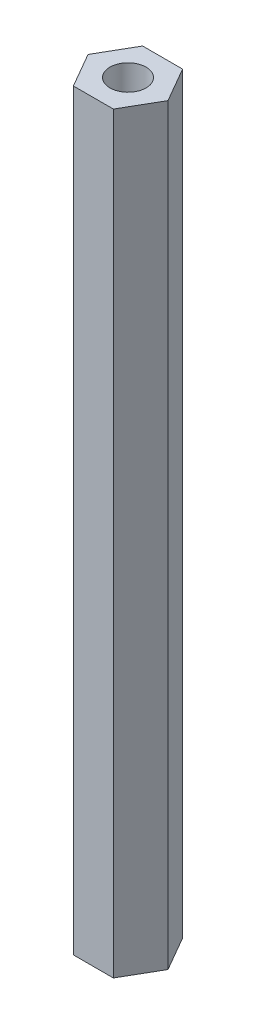
ISO-10303-21;
HEADER;
FILE_DESCRIPTION(('STEP AP214'),'2;1');
FILE_NAME('part.step','',(''),(''),'','','');
FILE_SCHEMA(('AUTOMOTIVE_DESIGN { 1 0 10303 214 1 1 1 1 }'));
ENDSEC;
DATA;
#1=APPLICATION_CONTEXT('core data for automotive mechanical design processes');
#2=APPLICATION_PROTOCOL_DEFINITION('international standard','automotive_design',2000,#1);
#3=PRODUCT_CONTEXT('',#1,'mechanical');
#4=PRODUCT('Part','Part','',(#3));
#5=PRODUCT_RELATED_PRODUCT_CATEGORY('part','',(#4));
#6=PRODUCT_DEFINITION_FORMATION('','',#4);
#7=PRODUCT_DEFINITION_CONTEXT('part definition',#1,'design');
#8=PRODUCT_DEFINITION('design','',#6,#7);
#9=PRODUCT_DEFINITION_SHAPE('','',#8);
#10=(LENGTH_UNIT() NAMED_UNIT(*) SI_UNIT(.MILLI.,.METRE.));
#11=(NAMED_UNIT(*) PLANE_ANGLE_UNIT() SI_UNIT($,.RADIAN.));
#12=(NAMED_UNIT(*) SI_UNIT($,.STERADIAN.) SOLID_ANGLE_UNIT());
#13=UNCERTAINTY_MEASURE_WITH_UNIT(LENGTH_MEASURE(1.E-05),#10,'distance_accuracy_value','');
#14=(GEOMETRIC_REPRESENTATION_CONTEXT(3) GLOBAL_UNCERTAINTY_ASSIGNED_CONTEXT((#13)) GLOBAL_UNIT_ASSIGNED_CONTEXT((#10,
#11,#12)) REPRESENTATION_CONTEXT('',''));
#15=CARTESIAN_POINT('',(0.,0.,0.));
#16=DIRECTION('',(0.,0.,1.));
#17=DIRECTION('',(1.,0.,0.));
#18=AXIS2_PLACEMENT_3D('',#15,#16,#17);
#19=CARTESIAN_POINT('',(0.,50.,0.));
#20=DIRECTION('',(0.,1.,0.));
#21=DIRECTION('',(0.,0.,1.));
#22=AXIS2_PLACEMENT_3D('',#19,#20,#21);
#23=PLANE('',#22);
#24=DIRECTION('',(0.499999999999995,0.,-0.866025403784442));
#25=VECTOR('',#24,1.);
#26=CARTESIAN_POINT('',(1.32790561913616,50.,2.29999999999998));
#27=LINE('',#26,#25);
#28=CARTESIAN_POINT('',(1.32790561913616,50.,2.29999999999998));
#29=VERTEX_POINT('',#28);
#30=CARTESIAN_POINT('',(2.65581123827227,50.,0.));
#31=VERTEX_POINT('',#30);
#32=EDGE_CURVE('E146',#29,#31,#27,.T.);
#33=ORIENTED_EDGE('',*,*,#32,.T.);
#34=DIRECTION('',(-0.500000000000001,0.,-0.866025403784438));
#35=VECTOR('',#34,1.);
#36=CARTESIAN_POINT('',(2.65581123827227,50.,0.));
#37=LINE('',#36,#35);
#38=CARTESIAN_POINT('',(1.32790561913613,50.,-2.3));
#39=VERTEX_POINT('',#38);
#40=EDGE_CURVE('E94',#31,#39,#37,.T.);
#41=ORIENTED_EDGE('',*,*,#40,.T.);
#42=DIRECTION('',(-1.,0.,0.));
#43=VECTOR('',#42,1.);
#44=CARTESIAN_POINT('',(1.32790561913613,50.,-2.3));
#45=LINE('',#44,#43);
#46=CARTESIAN_POINT('',(-1.32790561913615,50.,-2.29999999999999));
#47=VERTEX_POINT('',#46);
#48=EDGE_CURVE('E107',#39,#47,#45,.T.);
#49=ORIENTED_EDGE('',*,*,#48,.T.);
#50=DIRECTION('',(-0.499999999999995,0.,0.866025403784442));
#51=VECTOR('',#50,1.);
#52=CARTESIAN_POINT('',(-1.32790561913615,50.,-2.29999999999999));
#53=LINE('',#52,#51);
#54=CARTESIAN_POINT('',(-2.65581123827227,50.,0.));
#55=VERTEX_POINT('',#54);
#56=EDGE_CURVE('E101',#47,#55,#53,.T.);
#57=ORIENTED_EDGE('',*,*,#56,.T.);
#58=DIRECTION('',(0.500000000000007,0.,0.866025403784435));
#59=VECTOR('',#58,1.);
#60=CARTESIAN_POINT('',(-2.65581123827227,50.,0.));
#61=LINE('',#60,#59);
#62=CARTESIAN_POINT('',(-1.32790561913612,50.,2.30000000000001));
#63=VERTEX_POINT('',#62);
#64=EDGE_CURVE('E105',#55,#63,#61,.T.);
#65=ORIENTED_EDGE('',*,*,#64,.T.);
#66=DIRECTION('',(1.,0.,0.));
#67=VECTOR('',#66,1.);
#68=CARTESIAN_POINT('',(-1.32790561913612,50.,2.30000000000001));
#69=LINE('',#68,#67);
#70=EDGE_CURVE('E57',#63,#29,#69,.T.);
#71=ORIENTED_EDGE('',*,*,#70,.T.);
#72=EDGE_LOOP('',(#33,#41,#49,#57,#65,#71));
#73=FACE_BOUND('',#72,.T.);
#74=CARTESIAN_POINT('',(0.,50.,0.));
#75=DIRECTION('',(0.,1.,0.));
#76=DIRECTION('',(0.,0.,1.));
#77=AXIS2_PLACEMENT_3D('',#74,#75,#76);
#78=CIRCLE('',#77,1.2);
#79=CARTESIAN_POINT('',(0.,50.,1.2));
#80=VERTEX_POINT('',#79);
#81=EDGE_CURVE('E134',#80,#80,#78,.T.);
#82=ORIENTED_EDGE('',*,*,#81,.F.);
#83=EDGE_LOOP('',(#82));
#84=FACE_BOUND('',#83,.T.);
#85=ADVANCED_FACE('F39',(#73,#84),#23,.T.);
#86=CARTESIAN_POINT('',(0.,0.,0.));
#87=DIRECTION('',(0.,1.,0.));
#88=DIRECTION('',(0.,0.,1.));
#89=AXIS2_PLACEMENT_3D('',#86,#87,#88);
#90=PLANE('',#89);
#91=DIRECTION('',(0.499999999999995,0.,-0.866025403784442));
#92=VECTOR('',#91,1.);
#93=CARTESIAN_POINT('',(1.32790561913616,0.,2.29999999999998));
#94=LINE('',#93,#92);
#95=CARTESIAN_POINT('',(1.32790561913616,0.,2.29999999999998));
#96=VERTEX_POINT('',#95);
#97=CARTESIAN_POINT('',(2.65581123827227,0.,0.));
#98=VERTEX_POINT('',#97);
#99=EDGE_CURVE('E129',#96,#98,#94,.T.);
#100=ORIENTED_EDGE('',*,*,#99,.F.);
#101=DIRECTION('',(1.,0.,0.));
#102=VECTOR('',#101,1.);
#103=CARTESIAN_POINT('',(-1.32790561913612,0.,2.30000000000001));
#104=LINE('',#103,#102);
#105=CARTESIAN_POINT('',(-1.32790561913612,0.,2.30000000000001));
#106=VERTEX_POINT('',#105);
#107=EDGE_CURVE('E86',#106,#96,#104,.T.);
#108=ORIENTED_EDGE('',*,*,#107,.F.);
#109=DIRECTION('',(0.500000000000007,0.,0.866025403784435));
#110=VECTOR('',#109,1.);
#111=CARTESIAN_POINT('',(-2.65581123827227,0.,0.));
#112=LINE('',#111,#110);
#113=CARTESIAN_POINT('',(-2.65581123827227,0.,0.));
#114=VERTEX_POINT('',#113);
#115=EDGE_CURVE('E80',#114,#106,#112,.T.);
#116=ORIENTED_EDGE('',*,*,#115,.F.);
#117=DIRECTION('',(-0.499999999999995,0.,0.866025403784442));
#118=VECTOR('',#117,1.);
#119=CARTESIAN_POINT('',(-1.32790561913615,0.,-2.29999999999999));
#120=LINE('',#119,#118);
#121=CARTESIAN_POINT('',(-1.32790561913615,0.,-2.29999999999999));
#122=VERTEX_POINT('',#121);
#123=EDGE_CURVE('E116',#122,#114,#120,.T.);
#124=ORIENTED_EDGE('',*,*,#123,.F.);
#125=DIRECTION('',(-1.,0.,0.));
#126=VECTOR('',#125,1.);
#127=CARTESIAN_POINT('',(1.32790561913613,0.,-2.3));
#128=LINE('',#127,#126);
#129=CARTESIAN_POINT('',(1.32790561913613,0.,-2.3));
#130=VERTEX_POINT('',#129);
#131=EDGE_CURVE('E137',#130,#122,#128,.T.);
#132=ORIENTED_EDGE('',*,*,#131,.F.);
#133=DIRECTION('',(-0.500000000000001,0.,-0.866025403784438));
#134=VECTOR('',#133,1.);
#135=CARTESIAN_POINT('',(2.65581123827227,0.,0.));
#136=LINE('',#135,#134);
#137=EDGE_CURVE('E133',#98,#130,#136,.T.);
#138=ORIENTED_EDGE('',*,*,#137,.F.);
#139=EDGE_LOOP('',(#100,#108,#116,#124,#132,#138));
#140=FACE_BOUND('',#139,.T.);
#141=CARTESIAN_POINT('',(0.,0.,0.));
#142=DIRECTION('',(0.,1.,0.));
#143=DIRECTION('',(0.,0.,1.));
#144=AXIS2_PLACEMENT_3D('',#141,#142,#143);
#145=CIRCLE('',#144,1.2);
#146=CARTESIAN_POINT('',(0.,0.,1.2));
#147=VERTEX_POINT('',#146);
#148=EDGE_CURVE('E243',#147,#147,#145,.T.);
#149=ORIENTED_EDGE('',*,*,#148,.T.);
#150=EDGE_LOOP('',(#149));
#151=FACE_BOUND('',#150,.T.);
#152=ADVANCED_FACE('F159',(#140,#151),#90,.F.);
#153=CARTESIAN_POINT('',(1.32790561913616,50.,2.29999999999998));
#154=DIRECTION('',(-0.866025403784442,0.,-0.499999999999995));
#155=DIRECTION('',(-0.499999999999995,0.,0.866025403784442));
#156=AXIS2_PLACEMENT_3D('',#153,#154,#155);
#157=PLANE('',#156);
#158=ORIENTED_EDGE('',*,*,#99,.T.);
#159=DIRECTION('',(0.,-1.,0.));
#160=VECTOR('',#159,1.);
#161=CARTESIAN_POINT('',(2.65581123827227,50.,0.));
#162=LINE('',#161,#160);
#163=EDGE_CURVE('E11',#31,#98,#162,.T.);
#164=ORIENTED_EDGE('',*,*,#163,.F.);
#165=ORIENTED_EDGE('',*,*,#32,.F.);
#166=DIRECTION('',(0.,-1.,0.));
#167=VECTOR('',#166,1.);
#168=CARTESIAN_POINT('',(1.32790561913616,50.,2.29999999999998));
#169=LINE('',#168,#167);
#170=EDGE_CURVE('E125',#29,#96,#169,.T.);
#171=ORIENTED_EDGE('',*,*,#170,.T.);
#172=EDGE_LOOP('',(#158,#164,#165,#171));
#173=FACE_BOUND('',#172,.T.);
#174=ADVANCED_FACE('F41',(#173),#157,.F.);
#175=CARTESIAN_POINT('',(2.65581123827227,50.,0.));
#176=DIRECTION('',(-0.866025403784438,0.,0.500000000000001));
#177=DIRECTION('',(0.500000000000001,0.,0.866025403784438));
#178=AXIS2_PLACEMENT_3D('',#175,#176,#177);
#179=PLANE('',#178);
#180=ORIENTED_EDGE('',*,*,#137,.T.);
#181=DIRECTION('',(0.,-1.,0.));
#182=VECTOR('',#181,1.);
#183=CARTESIAN_POINT('',(1.32790561913613,50.,-2.3));
#184=LINE('',#183,#182);
#185=EDGE_CURVE('E49',#39,#130,#184,.T.);
#186=ORIENTED_EDGE('',*,*,#185,.F.);
#187=ORIENTED_EDGE('',*,*,#40,.F.);
#188=ORIENTED_EDGE('',*,*,#163,.T.);
#189=EDGE_LOOP('',(#180,#186,#187,#188));
#190=FACE_BOUND('',#189,.T.);
#191=ADVANCED_FACE('F184',(#190),#179,.F.);
#192=CARTESIAN_POINT('',(1.32790561913613,50.,-2.3));
#193=DIRECTION('',(0.,0.,1.));
#194=DIRECTION('',(1.,0.,0.));
#195=AXIS2_PLACEMENT_3D('',#192,#193,#194);
#196=PLANE('',#195);
#197=ORIENTED_EDGE('',*,*,#131,.T.);
#198=DIRECTION('',(0.,-1.,0.));
#199=VECTOR('',#198,1.);
#200=CARTESIAN_POINT('',(-1.32790561913615,50.,-2.29999999999999));
#201=LINE('',#200,#199);
#202=EDGE_CURVE('E118',#47,#122,#201,.T.);
#203=ORIENTED_EDGE('',*,*,#202,.F.);
#204=ORIENTED_EDGE('',*,*,#48,.F.);
#205=ORIENTED_EDGE('',*,*,#185,.T.);
#206=EDGE_LOOP('',(#197,#203,#204,#205));
#207=FACE_BOUND('',#206,.T.);
#208=ADVANCED_FACE('F156',(#207),#196,.F.);
#209=CARTESIAN_POINT('',(-1.32790561913615,50.,-2.29999999999999));
#210=DIRECTION('',(0.866025403784442,0.,0.499999999999995));
#211=DIRECTION('',(0.499999999999995,0.,-0.866025403784442));
#212=AXIS2_PLACEMENT_3D('',#209,#210,#211);
#213=PLANE('',#212);
#214=ORIENTED_EDGE('',*,*,#123,.T.);
#215=DIRECTION('',(0.,-1.,0.));
#216=VECTOR('',#215,1.);
#217=CARTESIAN_POINT('',(-2.65581123827227,50.,0.));
#218=LINE('',#217,#216);
#219=EDGE_CURVE('E113',#55,#114,#218,.T.);
#220=ORIENTED_EDGE('',*,*,#219,.F.);
#221=ORIENTED_EDGE('',*,*,#56,.F.);
#222=ORIENTED_EDGE('',*,*,#202,.T.);
#223=EDGE_LOOP('',(#214,#220,#221,#222));
#224=FACE_BOUND('',#223,.T.);
#225=ADVANCED_FACE('F114',(#224),#213,.F.);
#226=CARTESIAN_POINT('',(-2.65581123827227,50.,0.));
#227=DIRECTION('',(0.866025403784435,0.,-0.500000000000007));
#228=DIRECTION('',(-0.500000000000007,0.,-0.866025403784435));
#229=AXIS2_PLACEMENT_3D('',#226,#227,#228);
#230=PLANE('',#229);
#231=ORIENTED_EDGE('',*,*,#115,.T.);
#232=DIRECTION('',(0.,-1.,0.));
#233=VECTOR('',#232,1.);
#234=CARTESIAN_POINT('',(-1.32790561913612,50.,2.30000000000001));
#235=LINE('',#234,#233);
#236=EDGE_CURVE('E119',#63,#106,#235,.T.);
#237=ORIENTED_EDGE('',*,*,#236,.F.);
#238=ORIENTED_EDGE('',*,*,#64,.F.);
#239=ORIENTED_EDGE('',*,*,#219,.T.);
#240=EDGE_LOOP('',(#231,#237,#238,#239));
#241=FACE_BOUND('',#240,.T.);
#242=ADVANCED_FACE('F121',(#241),#230,.F.);
#243=CARTESIAN_POINT('',(-1.32790561913612,50.,2.30000000000001));
#244=DIRECTION('',(0.,0.,-1.));
#245=DIRECTION('',(-1.,0.,0.));
#246=AXIS2_PLACEMENT_3D('',#243,#244,#245);
#247=PLANE('',#246);
#248=ORIENTED_EDGE('',*,*,#107,.T.);
#249=ORIENTED_EDGE('',*,*,#170,.F.);
#250=ORIENTED_EDGE('',*,*,#70,.F.);
#251=ORIENTED_EDGE('',*,*,#236,.T.);
#252=EDGE_LOOP('',(#248,#249,#250,#251));
#253=FACE_BOUND('',#252,.T.);
#254=ADVANCED_FACE('F164',(#253),#247,.F.);
#255=CARTESIAN_POINT('',(0.,50.,0.));
#256=DIRECTION('',(0.,-1.,0.));
#257=DIRECTION('',(0.,0.,-1.));
#258=AXIS2_PLACEMENT_3D('',#255,#256,#257);
#259=CYLINDRICAL_SURFACE('',#258,1.2);
#260=ORIENTED_EDGE('',*,*,#81,.T.);
#261=EDGE_LOOP('',(#260));
#262=FACE_BOUND('',#261,.T.);
#263=ORIENTED_EDGE('',*,*,#148,.F.);
#264=EDGE_LOOP('',(#263));
#265=FACE_BOUND('',#264,.T.);
#266=ADVANCED_FACE('F166',(#262,#265),#259,.F.);
#267=CLOSED_SHELL('',(#85,#152,#174,#191,#208,#225,#242,#254,#266));
#268=MANIFOLD_SOLID_BREP('B2',#267);
#269=ADVANCED_BREP_SHAPE_REPRESENTATION('',(#18,#268),#14);
#270=SHAPE_DEFINITION_REPRESENTATION(#9,#269);
ENDSEC;
END-ISO-10303-21;
